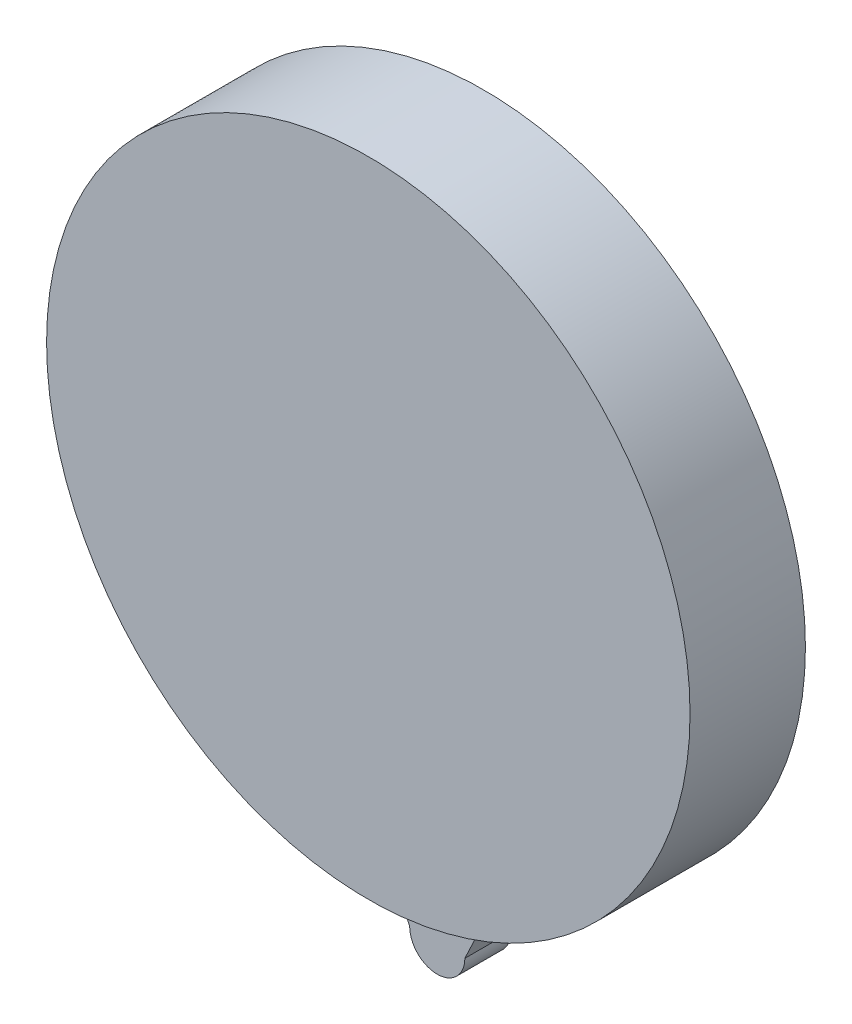
ISO-10303-21;
HEADER;
FILE_DESCRIPTION(('STEP AP214'),'2;1');
FILE_NAME('part.step','',(''),(''),'','','');
FILE_SCHEMA(('AUTOMOTIVE_DESIGN { 1 0 10303 214 1 1 1 1 }'));
ENDSEC;
DATA;
#1=APPLICATION_CONTEXT('core data for automotive mechanical design processes');
#2=APPLICATION_PROTOCOL_DEFINITION('international standard','automotive_design',2000,#1);
#3=PRODUCT_CONTEXT('',#1,'mechanical');
#4=PRODUCT('Part','Part','',(#3));
#5=PRODUCT_RELATED_PRODUCT_CATEGORY('part','',(#4));
#6=PRODUCT_DEFINITION_FORMATION('','',#4);
#7=PRODUCT_DEFINITION_CONTEXT('part definition',#1,'design');
#8=PRODUCT_DEFINITION('design','',#6,#7);
#9=PRODUCT_DEFINITION_SHAPE('','',#8);
#10=(LENGTH_UNIT() NAMED_UNIT(*) SI_UNIT(.MILLI.,.METRE.));
#11=(NAMED_UNIT(*) PLANE_ANGLE_UNIT() SI_UNIT($,.RADIAN.));
#12=(NAMED_UNIT(*) SI_UNIT($,.STERADIAN.) SOLID_ANGLE_UNIT());
#13=UNCERTAINTY_MEASURE_WITH_UNIT(LENGTH_MEASURE(1.E-05),#10,'distance_accuracy_value','');
#14=(GEOMETRIC_REPRESENTATION_CONTEXT(3) GLOBAL_UNCERTAINTY_ASSIGNED_CONTEXT((#13)) GLOBAL_UNIT_ASSIGNED_CONTEXT((#10,
#11,#12)) REPRESENTATION_CONTEXT('',''));
#15=CARTESIAN_POINT('',(0.,0.,0.));
#16=DIRECTION('',(0.,0.,1.));
#17=DIRECTION('',(1.,0.,0.));
#18=AXIS2_PLACEMENT_3D('',#15,#16,#17);
#19=CARTESIAN_POINT('',(0.,0.,0.));
#20=DIRECTION('',(0.,0.,1.));
#21=DIRECTION('',(1.,0.,0.));
#22=AXIS2_PLACEMENT_3D('',#19,#20,#21);
#23=PLANE('',#22);
#24=CARTESIAN_POINT('',(0.,0.,0.));
#25=DIRECTION('',(0.,0.,-1.));
#26=DIRECTION('',(-1.,0.,0.));
#27=AXIS2_PLACEMENT_3D('',#24,#25,#26);
#28=CIRCLE('',#27,70.);
#29=CARTESIAN_POINT('',(13.9789806495325,-68.59,0.));
#30=VERTEX_POINT('',#29);
#31=CARTESIAN_POINT('',(-13.9789806495325,-68.59,0.));
#32=VERTEX_POINT('',#31);
#33=EDGE_CURVE('E136',#30,#32,#28,.T.);
#34=ORIENTED_EDGE('',*,*,#33,.F.);
#35=DIRECTION('',(0.424880467128531,0.905249462111213,0.));
#36=VECTOR('',#35,1.);
#37=CARTESIAN_POINT('',(37.8367262103918,-17.7587356631985,0.));
#38=LINE('',#37,#36);
#39=CARTESIAN_POINT('',(6.00000000000001,-85.59,0.));
#40=VERTEX_POINT('',#39);
#41=EDGE_CURVE('E154',#40,#30,#38,.T.);
#42=ORIENTED_EDGE('',*,*,#41,.F.);
#43=CARTESIAN_POINT('',(0.,-85.59,0.));
#44=DIRECTION('',(0.,0.,1.));
#45=DIRECTION('',(1.,0.,0.));
#46=AXIS2_PLACEMENT_3D('',#43,#44,#45);
#47=CIRCLE('',#46,6.00000000000001);
#48=CARTESIAN_POINT('',(-6.00000000000001,-85.59,0.));
#49=VERTEX_POINT('',#48);
#50=EDGE_CURVE('E158',#49,#40,#47,.T.);
#51=ORIENTED_EDGE('',*,*,#50,.F.);
#52=DIRECTION('',(-0.424880467128531,0.905249462111213,0.));
#53=VECTOR('',#52,1.);
#54=CARTESIAN_POINT('',(-37.8367262103918,-17.7587356631985,0.));
#55=LINE('',#54,#53);
#56=EDGE_CURVE('E168',#49,#32,#55,.T.);
#57=ORIENTED_EDGE('',*,*,#56,.T.);
#58=EDGE_LOOP('',(#34,#42,#51,#57));
#59=FACE_BOUND('',#58,.T.);
#60=ADVANCED_FACE('F37',(#59),#23,.F.);
#61=CARTESIAN_POINT('',(0.,0.,25.));
#62=DIRECTION('',(0.,0.,-1.));
#63=DIRECTION('',(-1.,0.,0.));
#64=AXIS2_PLACEMENT_3D('',#61,#62,#63);
#65=CYLINDRICAL_SURFACE('',#64,70.);
#66=CARTESIAN_POINT('',(0.,0.,25.));
#67=DIRECTION('',(0.,0.,1.));
#68=DIRECTION('',(1.,0.,0.));
#69=AXIS2_PLACEMENT_3D('',#66,#67,#68);
#70=CIRCLE('',#69,70.);
#71=CARTESIAN_POINT('',(70.,0.,25.));
#72=VERTEX_POINT('',#71);
#73=EDGE_CURVE('E11',#72,#72,#70,.T.);
#74=ORIENTED_EDGE('',*,*,#73,.F.);
#75=EDGE_LOOP('',(#74));
#76=FACE_BOUND('',#75,.T.);
#77=DIRECTION('',(0.,0.,-1.));
#78=VECTOR('',#77,1.);
#79=CARTESIAN_POINT('',(13.9789806495325,-68.59,10.));
#80=LINE('',#79,#78);
#81=CARTESIAN_POINT('',(13.9789806495325,-68.59,10.));
#82=VERTEX_POINT('',#81);
#83=EDGE_CURVE('E45',#82,#30,#80,.T.);
#84=ORIENTED_EDGE('',*,*,#83,.T.);
#85=ORIENTED_EDGE('',*,*,#33,.T.);
#86=DIRECTION('',(0.,0.,-1.));
#87=VECTOR('',#86,1.);
#88=CARTESIAN_POINT('',(-13.9789806495325,-68.59,10.));
#89=LINE('',#88,#87);
#90=CARTESIAN_POINT('',(-13.9789806495325,-68.59,10.));
#91=VERTEX_POINT('',#90);
#92=EDGE_CURVE('E57',#91,#32,#89,.T.);
#93=ORIENTED_EDGE('',*,*,#92,.F.);
#94=CARTESIAN_POINT('',(0.,0.,10.));
#95=DIRECTION('',(0.,0.,1.));
#96=DIRECTION('',(1.,0.,0.));
#97=AXIS2_PLACEMENT_3D('',#94,#95,#96);
#98=CIRCLE('',#97,70.);
#99=EDGE_CURVE('E52',#82,#91,#98,.F.);
#100=ORIENTED_EDGE('',*,*,#99,.F.);
#101=EDGE_LOOP('',(#84,#85,#93,#100));
#102=FACE_BOUND('',#101,.T.);
#103=CARTESIAN_POINT('',(0.,0.,-0.1));
#104=DIRECTION('',(0.,0.,-1.));
#105=DIRECTION('',(-1.,0.,0.));
#106=AXIS2_PLACEMENT_3D('',#103,#104,#105);
#107=CIRCLE('',#106,70.);
#108=CARTESIAN_POINT('',(-70.,0.,-0.1));
#109=VERTEX_POINT('',#108);
#110=EDGE_CURVE('E151',#109,#109,#107,.T.);
#111=ORIENTED_EDGE('',*,*,#110,.F.);
#112=EDGE_LOOP('',(#111));
#113=FACE_BOUND('',#112,.T.);
#114=ADVANCED_FACE('F39',(#76,#102,#113),#65,.T.);
#115=CARTESIAN_POINT('',(0.,0.,25.));
#116=DIRECTION('',(0.,0.,1.));
#117=DIRECTION('',(1.,0.,0.));
#118=AXIS2_PLACEMENT_3D('',#115,#116,#117);
#119=PLANE('',#118);
#120=ORIENTED_EDGE('',*,*,#73,.T.);
#121=EDGE_LOOP('',(#120));
#122=FACE_BOUND('',#121,.T.);
#123=ADVANCED_FACE('F207',(#122),#119,.T.);
#124=CARTESIAN_POINT('',(37.8367262103918,-17.7587356631985,10.));
#125=DIRECTION('',(-0.905249462111213,0.424880467128532,0.));
#126=DIRECTION('',(-0.424880467128532,-0.905249462111213,0.));
#127=AXIS2_PLACEMENT_3D('',#124,#125,#126);
#128=PLANE('',#127);
#129=ORIENTED_EDGE('',*,*,#41,.T.);
#130=ORIENTED_EDGE('',*,*,#83,.F.);
#131=DIRECTION('',(0.424880467128531,0.905249462111213,0.));
#132=VECTOR('',#131,1.);
#133=CARTESIAN_POINT('',(37.8367262103918,-17.7587356631985,10.));
#134=LINE('',#133,#132);
#135=CARTESIAN_POINT('',(6.00000000000001,-85.59,10.));
#136=VERTEX_POINT('',#135);
#137=EDGE_CURVE('E156',#136,#82,#134,.T.);
#138=ORIENTED_EDGE('',*,*,#137,.F.);
#139=DIRECTION('',(0.,0.,-1.));
#140=VECTOR('',#139,1.);
#141=CARTESIAN_POINT('',(6.00000000000001,-85.59,10.));
#142=LINE('',#141,#140);
#143=EDGE_CURVE('E165',#136,#40,#142,.T.);
#144=ORIENTED_EDGE('',*,*,#143,.T.);
#145=EDGE_LOOP('',(#129,#130,#138,#144));
#146=FACE_BOUND('',#145,.T.);
#147=ADVANCED_FACE('F181',(#146),#128,.F.);
#148=CARTESIAN_POINT('',(-37.8367262103918,-17.7587356631985,10.));
#149=DIRECTION('',(-0.905249462111213,-0.424880467128532,0.));
#150=DIRECTION('',(0.424880467128532,-0.905249462111213,0.));
#151=AXIS2_PLACEMENT_3D('',#148,#149,#150);
#152=PLANE('',#151);
#153=ORIENTED_EDGE('',*,*,#56,.F.);
#154=DIRECTION('',(0.,0.,-1.));
#155=VECTOR('',#154,1.);
#156=CARTESIAN_POINT('',(-6.00000000000001,-85.59,10.));
#157=LINE('',#156,#155);
#158=CARTESIAN_POINT('',(-6.00000000000001,-85.59,10.));
#159=VERTEX_POINT('',#158);
#160=EDGE_CURVE('E174',#159,#49,#157,.T.);
#161=ORIENTED_EDGE('',*,*,#160,.F.);
#162=DIRECTION('',(-0.424880467128531,0.905249462111213,0.));
#163=VECTOR('',#162,1.);
#164=CARTESIAN_POINT('',(-37.8367262103918,-17.7587356631985,10.));
#165=LINE('',#164,#163);
#166=EDGE_CURVE('E160',#159,#91,#165,.T.);
#167=ORIENTED_EDGE('',*,*,#166,.T.);
#168=ORIENTED_EDGE('',*,*,#92,.T.);
#169=EDGE_LOOP('',(#153,#161,#167,#168));
#170=FACE_BOUND('',#169,.T.);
#171=ADVANCED_FACE('F187',(#170),#152,.T.);
#172=CARTESIAN_POINT('',(0.,-85.59,10.));
#173=DIRECTION('',(0.,0.,-1.));
#174=DIRECTION('',(-1.,0.,0.));
#175=AXIS2_PLACEMENT_3D('',#172,#173,#174);
#176=CYLINDRICAL_SURFACE('',#175,6.00000000000001);
#177=ORIENTED_EDGE('',*,*,#50,.T.);
#178=ORIENTED_EDGE('',*,*,#143,.F.);
#179=CARTESIAN_POINT('',(0.,-85.59,10.));
#180=DIRECTION('',(0.,0.,1.));
#181=DIRECTION('',(1.,0.,0.));
#182=AXIS2_PLACEMENT_3D('',#179,#180,#181);
#183=CIRCLE('',#182,6.00000000000001);
#184=EDGE_CURVE('E163',#159,#136,#183,.T.);
#185=ORIENTED_EDGE('',*,*,#184,.F.);
#186=ORIENTED_EDGE('',*,*,#160,.T.);
#187=EDGE_LOOP('',(#177,#178,#185,#186));
#188=FACE_BOUND('',#187,.T.);
#189=ADVANCED_FACE('F193',(#188),#176,.T.);
#190=CARTESIAN_POINT('',(0.,0.,10.));
#191=DIRECTION('',(0.,0.,1.));
#192=DIRECTION('',(1.,0.,0.));
#193=AXIS2_PLACEMENT_3D('',#190,#191,#192);
#194=PLANE('',#193);
#195=ORIENTED_EDGE('',*,*,#137,.T.);
#196=ORIENTED_EDGE('',*,*,#99,.T.);
#197=ORIENTED_EDGE('',*,*,#166,.F.);
#198=ORIENTED_EDGE('',*,*,#184,.T.);
#199=EDGE_LOOP('',(#195,#196,#197,#198));
#200=FACE_BOUND('',#199,.T.);
#201=ADVANCED_FACE('F191',(#200),#194,.T.);
#202=CARTESIAN_POINT('',(0.,0.,-0.1));
#203=DIRECTION('',(0.,0.,-1.));
#204=DIRECTION('',(-1.,0.,0.));
#205=AXIS2_PLACEMENT_3D('',#202,#203,#204);
#206=PLANE('',#205);
#207=CARTESIAN_POINT('',(0.,0.,-0.0999999999999994));
#208=DIRECTION('',(0.,0.,-1.));
#209=DIRECTION('',(-1.,0.,0.));
#210=AXIS2_PLACEMENT_3D('',#207,#208,#209);
#211=CIRCLE('',#210,68.);
#212=CARTESIAN_POINT('',(-68.,0.,-0.0999999999999994));
#213=VERTEX_POINT('',#212);
#214=EDGE_CURVE('E112',#213,#213,#211,.T.);
#215=ORIENTED_EDGE('',*,*,#214,.F.);
#216=EDGE_LOOP('',(#215));
#217=FACE_BOUND('',#216,.T.);
#218=ORIENTED_EDGE('',*,*,#110,.T.);
#219=EDGE_LOOP('',(#218));
#220=FACE_BOUND('',#219,.T.);
#221=ADVANCED_FACE('F200',(#217,#220),#206,.T.);
#222=CARTESIAN_POINT('',(0.,0.,2.));
#223=DIRECTION('',(0.,0.,1.));
#224=DIRECTION('',(1.,0.,0.));
#225=AXIS2_PLACEMENT_3D('',#222,#223,#224);
#226=PLANE('',#225);
#227=CARTESIAN_POINT('',(0.,0.,2.));
#228=DIRECTION('',(0.,0.,1.));
#229=DIRECTION('',(1.,0.,0.));
#230=AXIS2_PLACEMENT_3D('',#227,#228,#229);
#231=CIRCLE('',#230,68.);
#232=CARTESIAN_POINT('',(12.5991739570328,-66.8226070697667,2.));
#233=VERTEX_POINT('',#232);
#234=CARTESIAN_POINT('',(-12.5991739570328,-66.8226070697667,2.));
#235=VERTEX_POINT('',#234);
#236=EDGE_CURVE('E101',#233,#235,#231,.F.);
#237=ORIENTED_EDGE('',*,*,#236,.T.);
#238=DIRECTION('',(-0.424880467128532,0.905249462111213,0.));
#239=VECTOR('',#238,1.);
#240=CARTESIAN_POINT('',(-36.0262272861694,-16.9089747289414,2.));
#241=LINE('',#240,#239);
#242=CARTESIAN_POINT('',(-3.9796765332102,-85.1872908108621,2.));
#243=VERTEX_POINT('',#242);
#244=EDGE_CURVE('E128',#243,#235,#241,.T.);
#245=ORIENTED_EDGE('',*,*,#244,.F.);
#246=CARTESIAN_POINT('',(0.,-85.59,2.));
#247=DIRECTION('',(0.,0.,1.));
#248=DIRECTION('',(1.,0.,0.));
#249=AXIS2_PLACEMENT_3D('',#246,#247,#248);
#250=CIRCLE('',#249,4.00000000000001);
#251=CARTESIAN_POINT('',(3.9796765332102,-85.1872908108621,2.));
#252=VERTEX_POINT('',#251);
#253=EDGE_CURVE('E126',#243,#252,#250,.T.);
#254=ORIENTED_EDGE('',*,*,#253,.T.);
#255=DIRECTION('',(0.424880467128532,0.905249462111213,0.));
#256=VECTOR('',#255,1.);
#257=CARTESIAN_POINT('',(36.0262272861694,-16.9089747289414,2.));
#258=LINE('',#257,#256);
#259=EDGE_CURVE('E119',#252,#233,#258,.T.);
#260=ORIENTED_EDGE('',*,*,#259,.T.);
#261=EDGE_LOOP('',(#237,#245,#254,#260));
#262=FACE_BOUND('',#261,.T.);
#263=ADVANCED_FACE('F124',(#262),#226,.T.);
#264=CARTESIAN_POINT('',(0.,0.,25.));
#265=DIRECTION('',(0.,0.,-1.));
#266=DIRECTION('',(-1.,0.,0.));
#267=AXIS2_PLACEMENT_3D('',#264,#265,#266);
#268=CYLINDRICAL_SURFACE('',#267,68.);
#269=CARTESIAN_POINT('',(0.,0.,23.));
#270=DIRECTION('',(0.,0.,1.));
#271=DIRECTION('',(1.,0.,0.));
#272=AXIS2_PLACEMENT_3D('',#269,#270,#271);
#273=CIRCLE('',#272,68.);
#274=CARTESIAN_POINT('',(68.,0.,23.));
#275=VERTEX_POINT('',#274);
#276=EDGE_CURVE('E122',#275,#275,#273,.T.);
#277=ORIENTED_EDGE('',*,*,#276,.T.);
#278=EDGE_LOOP('',(#277));
#279=FACE_BOUND('',#278,.T.);
#280=DIRECTION('',(0.,0.,-1.));
#281=VECTOR('',#280,1.);
#282=CARTESIAN_POINT('',(12.5991739570328,-66.8226070697667,8.));
#283=LINE('',#282,#281);
#284=CARTESIAN_POINT('',(12.5991739570328,-66.8226070697667,8.));
#285=VERTEX_POINT('',#284);
#286=EDGE_CURVE('E106',#285,#233,#283,.T.);
#287=ORIENTED_EDGE('',*,*,#286,.F.);
#288=CARTESIAN_POINT('',(0.,0.,8.));
#289=DIRECTION('',(0.,0.,1.));
#290=DIRECTION('',(1.,0.,0.));
#291=AXIS2_PLACEMENT_3D('',#288,#289,#290);
#292=CIRCLE('',#291,68.);
#293=CARTESIAN_POINT('',(-12.5991739570328,-66.8226070697667,8.));
#294=VERTEX_POINT('',#293);
#295=EDGE_CURVE('E140',#285,#294,#292,.F.);
#296=ORIENTED_EDGE('',*,*,#295,.T.);
#297=DIRECTION('',(0.,0.,-1.));
#298=VECTOR('',#297,1.);
#299=CARTESIAN_POINT('',(-12.5991739570328,-66.8226070697667,8.));
#300=LINE('',#299,#298);
#301=EDGE_CURVE('E107',#294,#235,#300,.T.);
#302=ORIENTED_EDGE('',*,*,#301,.T.);
#303=ORIENTED_EDGE('',*,*,#236,.F.);
#304=EDGE_LOOP('',(#287,#296,#302,#303));
#305=FACE_BOUND('',#304,.T.);
#306=ORIENTED_EDGE('',*,*,#214,.T.);
#307=EDGE_LOOP('',(#306));
#308=FACE_BOUND('',#307,.T.);
#309=ADVANCED_FACE('F103',(#279,#305,#308),#268,.F.);
#310=CARTESIAN_POINT('',(0.,0.,23.));
#311=DIRECTION('',(0.,0.,1.));
#312=DIRECTION('',(1.,0.,0.));
#313=AXIS2_PLACEMENT_3D('',#310,#311,#312);
#314=PLANE('',#313);
#315=ORIENTED_EDGE('',*,*,#276,.F.);
#316=EDGE_LOOP('',(#315));
#317=FACE_BOUND('',#316,.T.);
#318=ADVANCED_FACE('F254',(#317),#314,.F.);
#319=CARTESIAN_POINT('',(36.0262272861694,-16.9089747289414,10.));
#320=DIRECTION('',(-0.905249462111213,0.424880467128532,0.));
#321=DIRECTION('',(-0.424880467128532,-0.905249462111213,0.));
#322=AXIS2_PLACEMENT_3D('',#319,#320,#321);
#323=PLANE('',#322);
#324=ORIENTED_EDGE('',*,*,#259,.F.);
#325=DIRECTION('',(0.,0.,-1.));
#326=VECTOR('',#325,1.);
#327=CARTESIAN_POINT('',(3.9796765332102,-85.1872908108621,8.));
#328=LINE('',#327,#326);
#329=CARTESIAN_POINT('',(3.9796765332102,-85.1872908108621,8.));
#330=VERTEX_POINT('',#329);
#331=EDGE_CURVE('E144',#330,#252,#328,.T.);
#332=ORIENTED_EDGE('',*,*,#331,.F.);
#333=DIRECTION('',(0.424880467128532,0.905249462111213,0.));
#334=VECTOR('',#333,1.);
#335=CARTESIAN_POINT('',(36.0262272861694,-16.9089747289414,8.));
#336=LINE('',#335,#334);
#337=EDGE_CURVE('E121',#330,#285,#336,.T.);
#338=ORIENTED_EDGE('',*,*,#337,.T.);
#339=ORIENTED_EDGE('',*,*,#286,.T.);
#340=EDGE_LOOP('',(#324,#332,#338,#339));
#341=FACE_BOUND('',#340,.T.);
#342=ADVANCED_FACE('F117',(#341),#323,.T.);
#343=CARTESIAN_POINT('',(-36.0262272861694,-16.9089747289414,10.));
#344=DIRECTION('',(-0.905249462111213,-0.424880467128532,0.));
#345=DIRECTION('',(0.424880467128532,-0.905249462111213,0.));
#346=AXIS2_PLACEMENT_3D('',#343,#344,#345);
#347=PLANE('',#346);
#348=ORIENTED_EDGE('',*,*,#244,.T.);
#349=ORIENTED_EDGE('',*,*,#301,.F.);
#350=DIRECTION('',(-0.424880467128532,0.905249462111213,0.));
#351=VECTOR('',#350,1.);
#352=CARTESIAN_POINT('',(-36.0262272861694,-16.9089747289414,8.));
#353=LINE('',#352,#351);
#354=CARTESIAN_POINT('',(-3.9796765332102,-85.1872908108621,8.));
#355=VERTEX_POINT('',#354);
#356=EDGE_CURVE('E142',#355,#294,#353,.T.);
#357=ORIENTED_EDGE('',*,*,#356,.F.);
#358=DIRECTION('',(0.,0.,-1.));
#359=VECTOR('',#358,1.);
#360=CARTESIAN_POINT('',(-3.9796765332102,-85.1872908108621,8.));
#361=LINE('',#360,#359);
#362=EDGE_CURVE('E139',#355,#243,#361,.T.);
#363=ORIENTED_EDGE('',*,*,#362,.T.);
#364=EDGE_LOOP('',(#348,#349,#357,#363));
#365=FACE_BOUND('',#364,.T.);
#366=ADVANCED_FACE('F273',(#365),#347,.F.);
#367=CARTESIAN_POINT('',(0.,-85.59,10.));
#368=DIRECTION('',(0.,0.,-1.));
#369=DIRECTION('',(-1.,0.,0.));
#370=AXIS2_PLACEMENT_3D('',#367,#368,#369);
#371=CYLINDRICAL_SURFACE('',#370,4.00000000000001);
#372=ORIENTED_EDGE('',*,*,#253,.F.);
#373=ORIENTED_EDGE('',*,*,#362,.F.);
#374=CARTESIAN_POINT('',(0.,-85.59,8.));
#375=DIRECTION('',(0.,0.,1.));
#376=DIRECTION('',(1.,0.,0.));
#377=AXIS2_PLACEMENT_3D('',#374,#375,#376);
#378=CIRCLE('',#377,4.00000000000001);
#379=EDGE_CURVE('E146',#355,#330,#378,.T.);
#380=ORIENTED_EDGE('',*,*,#379,.T.);
#381=ORIENTED_EDGE('',*,*,#331,.T.);
#382=EDGE_LOOP('',(#372,#373,#380,#381));
#383=FACE_BOUND('',#382,.T.);
#384=ADVANCED_FACE('F282',(#383),#371,.F.);
#385=CARTESIAN_POINT('',(0.,0.,8.));
#386=DIRECTION('',(0.,0.,1.));
#387=DIRECTION('',(1.,0.,0.));
#388=AXIS2_PLACEMENT_3D('',#385,#386,#387);
#389=PLANE('',#388);
#390=ORIENTED_EDGE('',*,*,#337,.F.);
#391=ORIENTED_EDGE('',*,*,#379,.F.);
#392=ORIENTED_EDGE('',*,*,#356,.T.);
#393=ORIENTED_EDGE('',*,*,#295,.F.);
#394=EDGE_LOOP('',(#390,#391,#392,#393));
#395=FACE_BOUND('',#394,.T.);
#396=ADVANCED_FACE('F292',(#395),#389,.F.);
#397=CLOSED_SHELL('',(#60,#114,#123,#147,#171,#189,#201,#221,#263,#309,#318,#342,#366,#384,#396));
#398=MANIFOLD_SOLID_BREP('B2',#397);
#399=ADVANCED_BREP_SHAPE_REPRESENTATION('',(#18,#398),#14);
#400=SHAPE_DEFINITION_REPRESENTATION(#9,#399);
ENDSEC;
END-ISO-10303-21;
